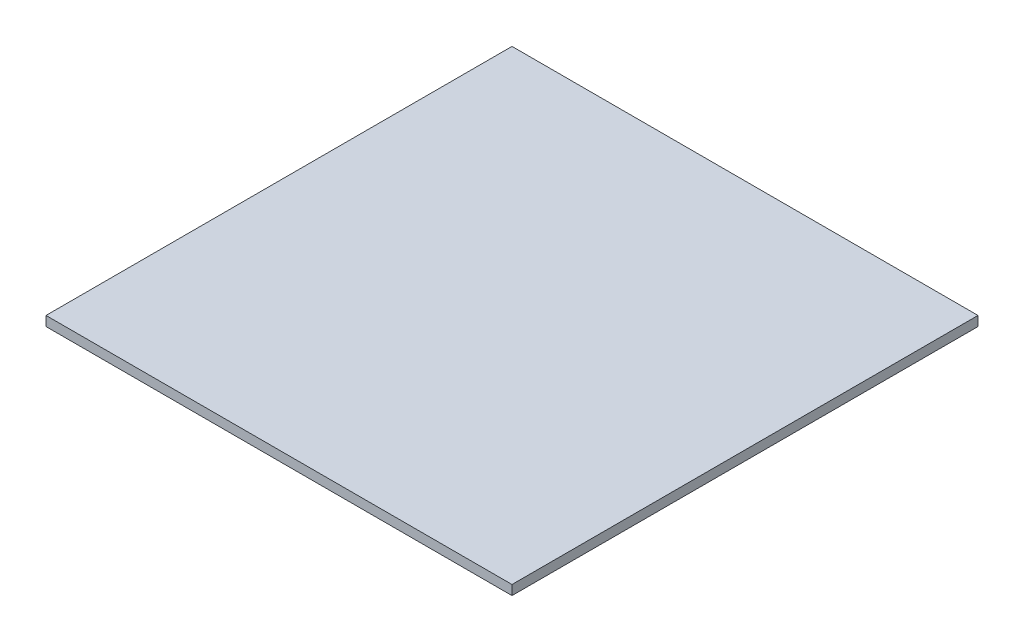
ISO-10303-21;
HEADER;
FILE_DESCRIPTION(('STEP AP214'),'2;1');
FILE_NAME('part.step','',(''),(''),'','','');
FILE_SCHEMA(('AUTOMOTIVE_DESIGN { 1 0 10303 214 1 1 1 1 }'));
ENDSEC;
DATA;
#1=APPLICATION_CONTEXT('core data for automotive mechanical design processes');
#2=APPLICATION_PROTOCOL_DEFINITION('international standard','automotive_design',2000,#1);
#3=PRODUCT_CONTEXT('',#1,'mechanical');
#4=PRODUCT('Part','Part','',(#3));
#5=PRODUCT_RELATED_PRODUCT_CATEGORY('part','',(#4));
#6=PRODUCT_DEFINITION_FORMATION('','',#4);
#7=PRODUCT_DEFINITION_CONTEXT('part definition',#1,'design');
#8=PRODUCT_DEFINITION('design','',#6,#7);
#9=PRODUCT_DEFINITION_SHAPE('','',#8);
#10=(LENGTH_UNIT() NAMED_UNIT(*) SI_UNIT(.MILLI.,.METRE.));
#11=(NAMED_UNIT(*) PLANE_ANGLE_UNIT() SI_UNIT($,.RADIAN.));
#12=(NAMED_UNIT(*) SI_UNIT($,.STERADIAN.) SOLID_ANGLE_UNIT());
#13=UNCERTAINTY_MEASURE_WITH_UNIT(LENGTH_MEASURE(1.E-05),#10,'distance_accuracy_value','');
#14=(GEOMETRIC_REPRESENTATION_CONTEXT(3) GLOBAL_UNCERTAINTY_ASSIGNED_CONTEXT((#13)) GLOBAL_UNIT_ASSIGNED_CONTEXT((#10,
#11,#12)) REPRESENTATION_CONTEXT('',''));
#15=CARTESIAN_POINT('',(0.,0.,0.));
#16=DIRECTION('',(0.,0.,1.));
#17=DIRECTION('',(1.,0.,0.));
#18=AXIS2_PLACEMENT_3D('',#15,#16,#17);
#19=CARTESIAN_POINT('',(72.5,3.,72.5));
#20=DIRECTION('',(-1.,0.,0.));
#21=DIRECTION('',(0.,0.,1.));
#22=AXIS2_PLACEMENT_3D('',#19,#20,#21);
#23=PLANE('',#22);
#24=DIRECTION('',(0.,0.,-1.));
#25=VECTOR('',#24,1.);
#26=CARTESIAN_POINT('',(72.5,0.,72.5));
#27=LINE('',#26,#25);
#28=CARTESIAN_POINT('',(72.5,0.,72.5));
#29=VERTEX_POINT('',#28);
#30=CARTESIAN_POINT('',(72.5,0.,-72.5));
#31=VERTEX_POINT('',#30);
#32=EDGE_CURVE('E102',#29,#31,#27,.T.);
#33=ORIENTED_EDGE('',*,*,#32,.T.);
#34=DIRECTION('',(0.,-1.,0.));
#35=VECTOR('',#34,1.);
#36=CARTESIAN_POINT('',(72.5,3.,-72.5));
#37=LINE('',#36,#35);
#38=CARTESIAN_POINT('',(72.5,3.,-72.5));
#39=VERTEX_POINT('',#38);
#40=EDGE_CURVE('E11',#39,#31,#37,.T.);
#41=ORIENTED_EDGE('',*,*,#40,.F.);
#42=DIRECTION('',(0.,0.,-1.));
#43=VECTOR('',#42,1.);
#44=CARTESIAN_POINT('',(72.5,3.,72.5));
#45=LINE('',#44,#43);
#46=CARTESIAN_POINT('',(72.5,3.,72.5));
#47=VERTEX_POINT('',#46);
#48=EDGE_CURVE('E90',#47,#39,#45,.T.);
#49=ORIENTED_EDGE('',*,*,#48,.F.);
#50=DIRECTION('',(0.,-1.,0.));
#51=VECTOR('',#50,1.);
#52=CARTESIAN_POINT('',(72.5,3.,72.5));
#53=LINE('',#52,#51);
#54=EDGE_CURVE('E98',#47,#29,#53,.T.);
#55=ORIENTED_EDGE('',*,*,#54,.T.);
#56=EDGE_LOOP('',(#33,#41,#49,#55));
#57=FACE_BOUND('',#56,.T.);
#58=ADVANCED_FACE('F39',(#57),#23,.F.);
#59=CARTESIAN_POINT('',(-72.5,3.,-72.5));
#60=DIRECTION('',(0.,0.,1.));
#61=DIRECTION('',(1.,0.,0.));
#62=AXIS2_PLACEMENT_3D('',#59,#60,#61);
#63=PLANE('',#62);
#64=DIRECTION('',(-1.,0.,0.));
#65=VECTOR('',#64,1.);
#66=CARTESIAN_POINT('',(-72.5,0.,-72.5));
#67=LINE('',#66,#65);
#68=CARTESIAN_POINT('',(-72.5,0.,-72.5));
#69=VERTEX_POINT('',#68);
#70=EDGE_CURVE('E94',#31,#69,#67,.T.);
#71=ORIENTED_EDGE('',*,*,#70,.T.);
#72=DIRECTION('',(0.,-1.,0.));
#73=VECTOR('',#72,1.);
#74=CARTESIAN_POINT('',(-72.5,3.,-72.5));
#75=LINE('',#74,#73);
#76=CARTESIAN_POINT('',(-72.5,3.,-72.5));
#77=VERTEX_POINT('',#76);
#78=EDGE_CURVE('E47',#77,#69,#75,.T.);
#79=ORIENTED_EDGE('',*,*,#78,.F.);
#80=DIRECTION('',(-1.,0.,0.));
#81=VECTOR('',#80,1.);
#82=CARTESIAN_POINT('',(-72.5,3.,-72.5));
#83=LINE('',#82,#81);
#84=EDGE_CURVE('E85',#39,#77,#83,.T.);
#85=ORIENTED_EDGE('',*,*,#84,.F.);
#86=ORIENTED_EDGE('',*,*,#40,.T.);
#87=EDGE_LOOP('',(#71,#79,#85,#86));
#88=FACE_BOUND('',#87,.T.);
#89=ADVANCED_FACE('F93',(#88),#63,.F.);
#90=CARTESIAN_POINT('',(-72.5,3.,72.5));
#91=DIRECTION('',(1.,0.,0.));
#92=DIRECTION('',(0.,0.,-1.));
#93=AXIS2_PLACEMENT_3D('',#90,#91,#92);
#94=PLANE('',#93);
#95=DIRECTION('',(0.,0.,1.));
#96=VECTOR('',#95,1.);
#97=CARTESIAN_POINT('',(-72.5,0.,72.5));
#98=LINE('',#97,#96);
#99=CARTESIAN_POINT('',(-72.5,0.,72.5));
#100=VERTEX_POINT('',#99);
#101=EDGE_CURVE('E72',#69,#100,#98,.T.);
#102=ORIENTED_EDGE('',*,*,#101,.T.);
#103=DIRECTION('',(0.,-1.,0.));
#104=VECTOR('',#103,1.);
#105=CARTESIAN_POINT('',(-72.5,3.,72.5));
#106=LINE('',#105,#104);
#107=CARTESIAN_POINT('',(-72.5,3.,72.5));
#108=VERTEX_POINT('',#107);
#109=EDGE_CURVE('E95',#108,#100,#106,.T.);
#110=ORIENTED_EDGE('',*,*,#109,.F.);
#111=DIRECTION('',(0.,0.,1.));
#112=VECTOR('',#111,1.);
#113=CARTESIAN_POINT('',(-72.5,3.,72.5));
#114=LINE('',#113,#112);
#115=EDGE_CURVE('E88',#77,#108,#114,.T.);
#116=ORIENTED_EDGE('',*,*,#115,.F.);
#117=ORIENTED_EDGE('',*,*,#78,.T.);
#118=EDGE_LOOP('',(#102,#110,#116,#117));
#119=FACE_BOUND('',#118,.T.);
#120=ADVANCED_FACE('F96',(#119),#94,.F.);
#121=CARTESIAN_POINT('',(-72.5,3.,72.5));
#122=DIRECTION('',(0.,0.,-1.));
#123=DIRECTION('',(-1.,0.,0.));
#124=AXIS2_PLACEMENT_3D('',#121,#122,#123);
#125=PLANE('',#124);
#126=DIRECTION('',(1.,0.,0.));
#127=VECTOR('',#126,1.);
#128=CARTESIAN_POINT('',(-72.5,0.,72.5));
#129=LINE('',#128,#127);
#130=EDGE_CURVE('E78',#100,#29,#129,.T.);
#131=ORIENTED_EDGE('',*,*,#130,.T.);
#132=ORIENTED_EDGE('',*,*,#54,.F.);
#133=DIRECTION('',(1.,0.,0.));
#134=VECTOR('',#133,1.);
#135=CARTESIAN_POINT('',(-72.5,3.,72.5));
#136=LINE('',#135,#134);
#137=EDGE_CURVE('E55',#108,#47,#136,.T.);
#138=ORIENTED_EDGE('',*,*,#137,.F.);
#139=ORIENTED_EDGE('',*,*,#109,.T.);
#140=EDGE_LOOP('',(#131,#132,#138,#139));
#141=FACE_BOUND('',#140,.T.);
#142=ADVANCED_FACE('F109',(#141),#125,.F.);
#143=CARTESIAN_POINT('',(0.,3.,0.));
#144=DIRECTION('',(0.,-1.,0.));
#145=DIRECTION('',(0.,0.,-1.));
#146=AXIS2_PLACEMENT_3D('',#143,#144,#145);
#147=PLANE('',#146);
#148=ORIENTED_EDGE('',*,*,#48,.T.);
#149=ORIENTED_EDGE('',*,*,#84,.T.);
#150=ORIENTED_EDGE('',*,*,#115,.T.);
#151=ORIENTED_EDGE('',*,*,#137,.T.);
#152=EDGE_LOOP('',(#148,#149,#150,#151));
#153=FACE_BOUND('',#152,.T.);
#154=ADVANCED_FACE('F86',(#153),#147,.F.);
#155=CARTESIAN_POINT('',(0.,0.,0.));
#156=DIRECTION('',(0.,-1.,0.));
#157=DIRECTION('',(0.,0.,-1.));
#158=AXIS2_PLACEMENT_3D('',#155,#156,#157);
#159=PLANE('',#158);
#160=ORIENTED_EDGE('',*,*,#32,.F.);
#161=ORIENTED_EDGE('',*,*,#130,.F.);
#162=ORIENTED_EDGE('',*,*,#101,.F.);
#163=ORIENTED_EDGE('',*,*,#70,.F.);
#164=EDGE_LOOP('',(#160,#161,#162,#163));
#165=FACE_BOUND('',#164,.T.);
#166=ADVANCED_FACE('F112',(#165),#159,.T.);
#167=CLOSED_SHELL('',(#58,#89,#120,#142,#154,#166));
#168=MANIFOLD_SOLID_BREP('B2',#167);
#169=ADVANCED_BREP_SHAPE_REPRESENTATION('',(#18,#168),#14);
#170=SHAPE_DEFINITION_REPRESENTATION(#9,#169);
ENDSEC;
END-ISO-10303-21;
